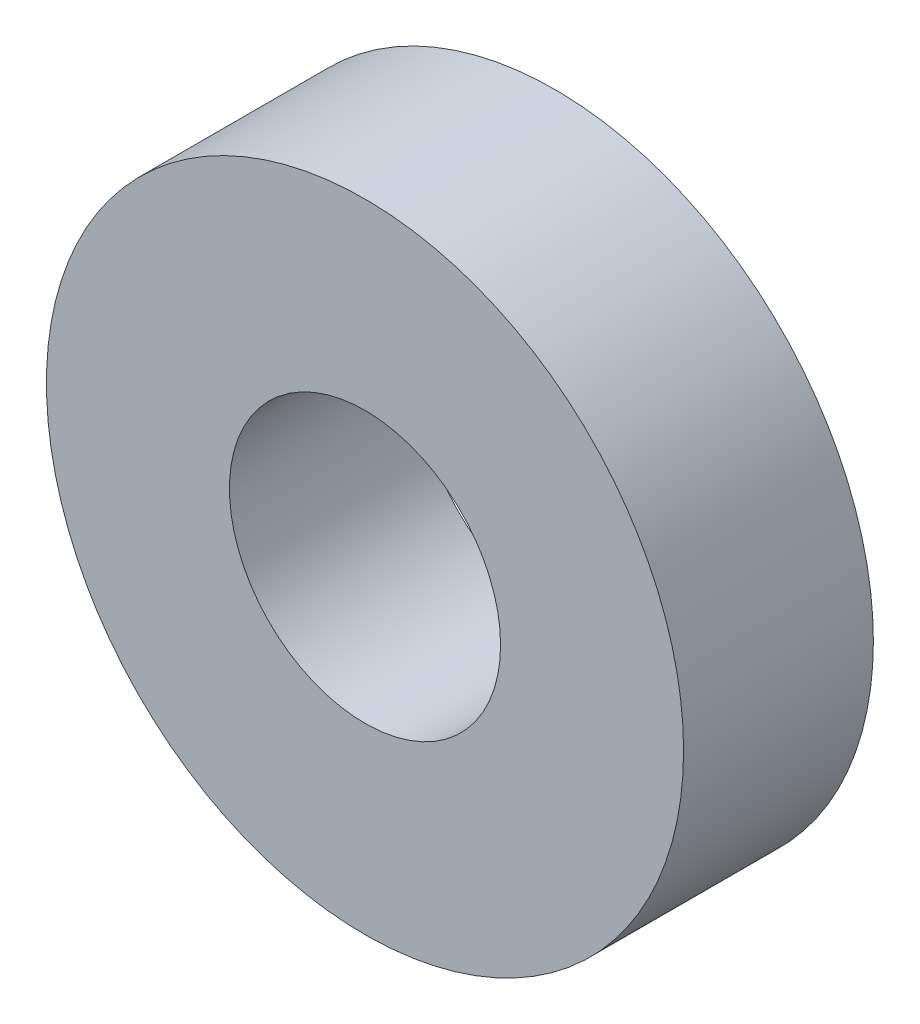
ISO-10303-21;
HEADER;
FILE_DESCRIPTION(('STEP AP214'),'2;1');
FILE_NAME('part.step','',(''),(''),'','','');
FILE_SCHEMA(('AUTOMOTIVE_DESIGN { 1 0 10303 214 1 1 1 1 }'));
ENDSEC;
DATA;
#1=APPLICATION_CONTEXT('core data for automotive mechanical design processes');
#2=APPLICATION_PROTOCOL_DEFINITION('international standard','automotive_design',2000,#1);
#3=PRODUCT_CONTEXT('',#1,'mechanical');
#4=PRODUCT('Part','Part','',(#3));
#5=PRODUCT_RELATED_PRODUCT_CATEGORY('part','',(#4));
#6=PRODUCT_DEFINITION_FORMATION('','',#4);
#7=PRODUCT_DEFINITION_CONTEXT('part definition',#1,'design');
#8=PRODUCT_DEFINITION('design','',#6,#7);
#9=PRODUCT_DEFINITION_SHAPE('','',#8);
#10=(LENGTH_UNIT() NAMED_UNIT(*) SI_UNIT(.MILLI.,.METRE.));
#11=(NAMED_UNIT(*) PLANE_ANGLE_UNIT() SI_UNIT($,.RADIAN.));
#12=(NAMED_UNIT(*) SI_UNIT($,.STERADIAN.) SOLID_ANGLE_UNIT());
#13=UNCERTAINTY_MEASURE_WITH_UNIT(LENGTH_MEASURE(1.E-05),#10,'distance_accuracy_value','');
#14=(GEOMETRIC_REPRESENTATION_CONTEXT(3) GLOBAL_UNCERTAINTY_ASSIGNED_CONTEXT((#13)) GLOBAL_UNIT_ASSIGNED_CONTEXT((#10,
#11,#12)) REPRESENTATION_CONTEXT('',''));
#15=CARTESIAN_POINT('',(0.,0.,0.));
#16=DIRECTION('',(0.,0.,1.));
#17=DIRECTION('',(1.,0.,0.));
#18=AXIS2_PLACEMENT_3D('',#15,#16,#17);
#19=CARTESIAN_POINT('',(0.,0.,14.));
#20=DIRECTION('',(0.,0.,1.));
#21=DIRECTION('',(1.,0.,0.));
#22=AXIS2_PLACEMENT_3D('',#19,#20,#21);
#23=PLANE('',#22);
#24=CARTESIAN_POINT('',(0.,0.,14.));
#25=DIRECTION('',(0.,0.,1.));
#26=DIRECTION('',(1.,0.,0.));
#27=AXIS2_PLACEMENT_3D('',#24,#25,#26);
#28=CIRCLE('',#27,23.5);
#29=CARTESIAN_POINT('',(23.5,0.,14.));
#30=VERTEX_POINT('',#29);
#31=EDGE_CURVE('E10',#30,#30,#28,.T.);
#32=ORIENTED_EDGE('',*,*,#31,.T.);
#33=EDGE_LOOP('',(#32));
#34=FACE_BOUND('',#33,.T.);
#35=CARTESIAN_POINT('',(0.,0.,14.));
#36=DIRECTION('',(0.,0.,1.));
#37=DIRECTION('',(1.,0.,0.));
#38=AXIS2_PLACEMENT_3D('',#35,#36,#37);
#39=CIRCLE('',#38,10.);
#40=CARTESIAN_POINT('',(10.,0.,14.));
#41=VERTEX_POINT('',#40);
#42=EDGE_CURVE('E44',#41,#41,#39,.T.);
#43=ORIENTED_EDGE('',*,*,#42,.F.);
#44=EDGE_LOOP('',(#43));
#45=FACE_BOUND('',#44,.T.);
#46=ADVANCED_FACE('F33',(#34,#45),#23,.T.);
#47=CARTESIAN_POINT('',(0.,0.,0.));
#48=DIRECTION('',(0.,0.,1.));
#49=DIRECTION('',(1.,0.,0.));
#50=AXIS2_PLACEMENT_3D('',#47,#48,#49);
#51=PLANE('',#50);
#52=CARTESIAN_POINT('',(0.,0.,0.));
#53=DIRECTION('',(0.,0.,1.));
#54=DIRECTION('',(1.,0.,0.));
#55=AXIS2_PLACEMENT_3D('',#52,#53,#54);
#56=CIRCLE('',#55,23.5);
#57=CARTESIAN_POINT('',(23.5,0.,0.));
#58=VERTEX_POINT('',#57);
#59=EDGE_CURVE('E37',#58,#58,#56,.T.);
#60=ORIENTED_EDGE('',*,*,#59,.F.);
#61=EDGE_LOOP('',(#60));
#62=FACE_BOUND('',#61,.T.);
#63=CARTESIAN_POINT('',(0.,0.,0.));
#64=DIRECTION('',(0.,0.,1.));
#65=DIRECTION('',(1.,0.,0.));
#66=AXIS2_PLACEMENT_3D('',#63,#64,#65);
#67=CIRCLE('',#66,10.);
#68=CARTESIAN_POINT('',(10.,0.,0.));
#69=VERTEX_POINT('',#68);
#70=EDGE_CURVE('E46',#69,#69,#67,.T.);
#71=ORIENTED_EDGE('',*,*,#70,.T.);
#72=EDGE_LOOP('',(#71));
#73=FACE_BOUND('',#72,.T.);
#74=ADVANCED_FACE('F56',(#62,#73),#51,.F.);
#75=CARTESIAN_POINT('',(0.,0.,14.));
#76=DIRECTION('',(0.,0.,-1.));
#77=DIRECTION('',(-1.,0.,0.));
#78=AXIS2_PLACEMENT_3D('',#75,#76,#77);
#79=CYLINDRICAL_SURFACE('',#78,23.5);
#80=ORIENTED_EDGE('',*,*,#31,.F.);
#81=EDGE_LOOP('',(#80));
#82=FACE_BOUND('',#81,.T.);
#83=ORIENTED_EDGE('',*,*,#59,.T.);
#84=EDGE_LOOP('',(#83));
#85=FACE_BOUND('',#84,.T.);
#86=ADVANCED_FACE('F35',(#82,#85),#79,.T.);
#87=CARTESIAN_POINT('',(0.,0.,14.));
#88=DIRECTION('',(0.,0.,-1.));
#89=DIRECTION('',(-1.,0.,0.));
#90=AXIS2_PLACEMENT_3D('',#87,#88,#89);
#91=CYLINDRICAL_SURFACE('',#90,10.);
#92=ORIENTED_EDGE('',*,*,#42,.T.);
#93=EDGE_LOOP('',(#92));
#94=FACE_BOUND('',#93,.T.);
#95=ORIENTED_EDGE('',*,*,#70,.F.);
#96=EDGE_LOOP('',(#95));
#97=FACE_BOUND('',#96,.T.);
#98=ADVANCED_FACE('F52',(#94,#97),#91,.F.);
#99=CLOSED_SHELL('',(#46,#74,#86,#98));
#100=MANIFOLD_SOLID_BREP('B2',#99);
#101=ADVANCED_BREP_SHAPE_REPRESENTATION('',(#18,#100),#14);
#102=SHAPE_DEFINITION_REPRESENTATION(#9,#101);
ENDSEC;
END-ISO-10303-21;
